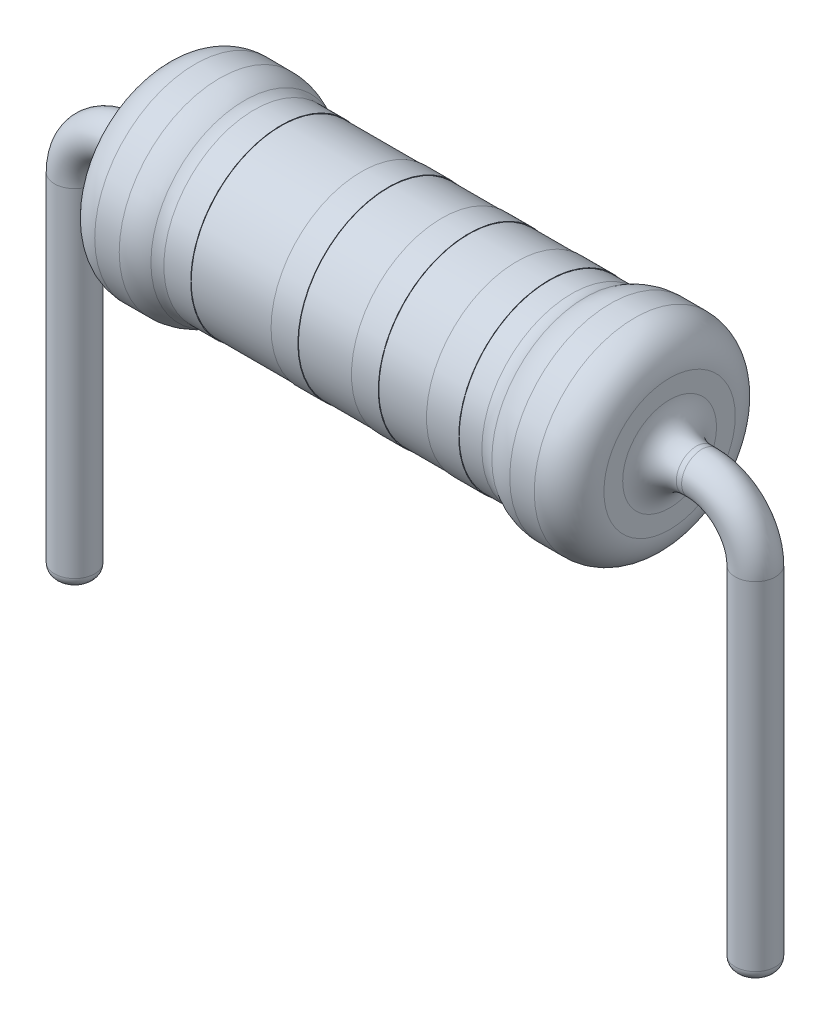
ISO-10303-21;
HEADER;
FILE_DESCRIPTION(('STEP AP214'),'2;1');
FILE_NAME('part.step','',(''),(''),'','','');
FILE_SCHEMA(('AUTOMOTIVE_DESIGN { 1 0 10303 214 1 1 1 1 }'));
ENDSEC;
DATA;
#1=APPLICATION_CONTEXT('core data for automotive mechanical design processes');
#2=APPLICATION_PROTOCOL_DEFINITION('international standard','automotive_design',2000,#1);
#3=PRODUCT_CONTEXT('',#1,'mechanical');
#4=PRODUCT('Part','Part','',(#3));
#5=PRODUCT_RELATED_PRODUCT_CATEGORY('part','',(#4));
#6=PRODUCT_DEFINITION_FORMATION('','',#4);
#7=PRODUCT_DEFINITION_CONTEXT('part definition',#1,'design');
#8=PRODUCT_DEFINITION('design','',#6,#7);
#9=PRODUCT_DEFINITION_SHAPE('','',#8);
#10=(LENGTH_UNIT() NAMED_UNIT(*) SI_UNIT(.MILLI.,.METRE.));
#11=(NAMED_UNIT(*) PLANE_ANGLE_UNIT() SI_UNIT($,.RADIAN.));
#12=(NAMED_UNIT(*) SI_UNIT($,.STERADIAN.) SOLID_ANGLE_UNIT());
#13=UNCERTAINTY_MEASURE_WITH_UNIT(LENGTH_MEASURE(1.E-05),#10,'distance_accuracy_value','');
#14=(GEOMETRIC_REPRESENTATION_CONTEXT(3) GLOBAL_UNCERTAINTY_ASSIGNED_CONTEXT((#13)) GLOBAL_UNIT_ASSIGNED_CONTEXT((#10,
#11,#12)) REPRESENTATION_CONTEXT('',''));
#15=CARTESIAN_POINT('',(0.,0.,0.));
#16=DIRECTION('',(0.,0.,1.));
#17=DIRECTION('',(1.,0.,0.));
#18=AXIS2_PLACEMENT_3D('',#15,#16,#17);
#19=CARTESIAN_POINT('',(6.35,0.,0.));
#20=DIRECTION('',(0.,-1.,0.));
#21=DIRECTION('',(0.,0.,-1.));
#22=AXIS2_PLACEMENT_3D('',#19,#20,#21);
#23=PLANE('',#22);
#24=CARTESIAN_POINT('',(6.35,0.,0.));
#25=DIRECTION('',(0.,1.,0.));
#26=DIRECTION('',(0.,0.,1.));
#27=AXIS2_PLACEMENT_3D('',#24,#25,#26);
#28=CIRCLE('',#27,0.175);
#29=CARTESIAN_POINT('',(6.35,0.,0.175000000000002));
#30=VERTEX_POINT('',#29);
#31=CARTESIAN_POINT('',(6.35,0.,-0.174999999999999));
#32=VERTEX_POINT('',#31);
#33=EDGE_CURVE('E73',#30,#32,#28,.T.);
#34=ORIENTED_EDGE('',*,*,#33,.F.);
#35=CARTESIAN_POINT('',(6.35,0.,0.));
#36=DIRECTION('',(0.,1.,0.));
#37=DIRECTION('',(0.,0.,-1.));
#38=AXIS2_PLACEMENT_3D('',#35,#36,#37);
#39=CIRCLE('',#38,0.175);
#40=EDGE_CURVE('E69',#32,#30,#39,.T.);
#41=ORIENTED_EDGE('',*,*,#40,.F.);
#42=EDGE_LOOP('',(#34,#41));
#43=FACE_BOUND('',#42,.T.);
#44=ADVANCED_FACE('F16',(#43),#23,.T.);
#45=CARTESIAN_POINT('',(6.35,0.2,-0.174999999999999));
#46=DIRECTION('',(1.,0.,0.));
#47=DIRECTION('',(0.,0.,-1.));
#48=AXIS2_PLACEMENT_3D('',#45,#46,#47);
#49=CIRCLE('',#48,0.2);
#50=TRIMMED_CURVE('',#49,(PARAMETER_VALUE(-2.63623214330564)),
(PARAMETER_VALUE(2.63623214330564)),.T.,.PARAMETER.);
#51=CARTESIAN_POINT('',(6.35,0.2,0.));
#52=DIRECTION('',(0.,-1.,0.));
#53=AXIS1_PLACEMENT('',#51,#52);
#54=SURFACE_OF_REVOLUTION('',#50,#53);
#55=ORIENTED_EDGE('',*,*,#40,.T.);
#56=ORIENTED_EDGE('',*,*,#33,.T.);
#57=EDGE_LOOP('',(#55,#56));
#58=FACE_BOUND('',#57,.T.);
#59=CARTESIAN_POINT('',(6.35,0.2,0.));
#60=DIRECTION('',(0.,1.,0.));
#61=DIRECTION('',(0.,0.,1.));
#62=AXIS2_PLACEMENT_3D('',#59,#60,#61);
#63=CIRCLE('',#62,0.375);
#64=CARTESIAN_POINT('',(6.35,0.2,0.375000000000002));
#65=VERTEX_POINT('',#64);
#66=EDGE_CURVE('E80',#65,#65,#63,.T.);
#67=ORIENTED_EDGE('',*,*,#66,.F.);
#68=EDGE_LOOP('',(#67));
#69=FACE_BOUND('',#68,.T.);
#70=ADVANCED_FACE('F78',(#58,#69),#54,.F.);
#71=CARTESIAN_POINT('',(6.35,0.,0.));
#72=DIRECTION('',(0.,1.,0.));
#73=DIRECTION('',(0.,0.,1.));
#74=AXIS2_PLACEMENT_3D('',#71,#72,#73);
#75=CYLINDRICAL_SURFACE('',#74,0.375);
#76=CARTESIAN_POINT('',(6.35,6.5,0.));
#77=DIRECTION('',(0.,1.,0.));
#78=DIRECTION('',(0.,0.,1.));
#79=AXIS2_PLACEMENT_3D('',#76,#77,#78);
#80=CIRCLE('',#79,0.375);
#81=CARTESIAN_POINT('',(6.725,6.5,0.));
#82=VERTEX_POINT('',#81);
#83=EDGE_CURVE('E107',#82,#82,#80,.T.);
#84=ORIENTED_EDGE('',*,*,#83,.F.);
#85=EDGE_LOOP('',(#84));
#86=FACE_BOUND('',#85,.T.);
#87=ORIENTED_EDGE('',*,*,#66,.T.);
#88=EDGE_LOOP('',(#87));
#89=FACE_BOUND('',#88,.T.);
#90=ADVANCED_FACE('F97',(#86,#89),#75,.T.);
#91=CARTESIAN_POINT('',(5.35,6.5,0.));
#92=DIRECTION('',(0.,0.,1.));
#93=DIRECTION('',(1.,0.,0.));
#94=AXIS2_PLACEMENT_3D('',#91,#92,#93);
#95=TOROIDAL_SURFACE('',#94,1.,0.375);
#96=CARTESIAN_POINT('',(5.35,7.5,0.));
#97=DIRECTION('',(-1.,0.,0.));
#98=DIRECTION('',(0.,0.,1.));
#99=AXIS2_PLACEMENT_3D('',#96,#97,#98);
#100=CIRCLE('',#99,0.375);
#101=CARTESIAN_POINT('',(5.35,7.87500000000001,0.));
#102=VERTEX_POINT('',#101);
#103=EDGE_CURVE('E105',#102,#102,#100,.T.);
#104=CARTESIAN_POINT('',(5.35,6.5,0.));
#105=DIRECTION('',(0.,0.,1.));
#106=DIRECTION('',(1.,0.,0.));
#107=AXIS2_PLACEMENT_3D('',#104,#105,#106);
#108=CIRCLE('',#107,1.375);
#109=EDGE_CURVE('',#82,#102,#108,.T.);
#110=ORIENTED_EDGE('',*,*,#83,.T.);
#111=ORIENTED_EDGE('',*,*,#103,.F.);
#112=ORIENTED_EDGE('',*,*,#109,.T.);
#113=ORIENTED_EDGE('',*,*,#109,.F.);
#114=EDGE_LOOP('',(#110,#112,#111,#113));
#115=FACE_BOUND('',#114,.T.);
#116=ADVANCED_FACE('F124',(#115),#95,.T.);
#117=CARTESIAN_POINT('',(5.35,7.5,0.));
#118=DIRECTION('',(-1.,0.,0.));
#119=DIRECTION('',(0.,0.,1.));
#120=AXIS2_PLACEMENT_3D('',#117,#118,#119);
#121=CYLINDRICAL_SURFACE('',#120,0.375);
#122=CARTESIAN_POINT('',(5.25,7.5,0.));
#123=DIRECTION('',(1.,0.,0.));
#124=DIRECTION('',(0.,0.,-1.));
#125=AXIS2_PLACEMENT_3D('',#122,#123,#124);
#126=CIRCLE('',#125,0.375);
#127=CARTESIAN_POINT('',(5.25,7.5,-0.375));
#128=VERTEX_POINT('',#127);
#129=EDGE_CURVE('E119',#128,#128,#126,.T.);
#130=ORIENTED_EDGE('',*,*,#129,.T.);
#131=EDGE_LOOP('',(#130));
#132=FACE_BOUND('',#131,.T.);
#133=ORIENTED_EDGE('',*,*,#103,.T.);
#134=EDGE_LOOP('',(#133));
#135=FACE_BOUND('',#134,.T.);
#136=ADVANCED_FACE('F130',(#132,#135),#121,.T.);
#137=CARTESIAN_POINT('',(5.25,7.5,0.));
#138=DIRECTION('',(1.,0.,0.));
#139=DIRECTION('',(0.,0.,-1.));
#140=AXIS2_PLACEMENT_3D('',#137,#138,#139);
#141=TOROIDAL_SURFACE('',#140,0.875,0.5);
#142=ORIENTED_EDGE('',*,*,#129,.F.);
#143=EDGE_LOOP('',(#142));
#144=FACE_BOUND('',#143,.T.);
#145=CARTESIAN_POINT('',(4.75,7.5,0.));
#146=DIRECTION('',(1.,0.,0.));
#147=DIRECTION('',(0.,0.,1.));
#148=AXIS2_PLACEMENT_3D('',#145,#146,#147);
#149=CIRCLE('',#148,0.875);
#150=CARTESIAN_POINT('',(4.75,7.5,-0.875));
#151=VERTEX_POINT('',#150);
#152=CARTESIAN_POINT('',(4.75,7.5,0.875));
#153=VERTEX_POINT('',#152);
#154=EDGE_CURVE('E344',#151,#153,#149,.F.);
#155=ORIENTED_EDGE('',*,*,#154,.F.);
#156=CARTESIAN_POINT('',(4.75,7.5,0.));
#157=DIRECTION('',(1.,0.,0.));
#158=DIRECTION('',(0.,0.,-1.));
#159=AXIS2_PLACEMENT_3D('',#156,#157,#158);
#160=CIRCLE('',#159,0.875);
#161=EDGE_CURVE('E354',#153,#151,#160,.F.);
#162=ORIENTED_EDGE('',*,*,#161,.F.);
#163=EDGE_LOOP('',(#155,#162));
#164=FACE_BOUND('',#163,.T.);
#165=ADVANCED_FACE('F374',(#144,#164),#141,.F.);
#166=CARTESIAN_POINT('',(4.75,0.,0.));
#167=DIRECTION('',(1.,0.,0.));
#168=DIRECTION('',(0.,0.,-1.));
#169=AXIS2_PLACEMENT_3D('',#166,#167,#168);
#170=PLANE('',#169);
#171=ORIENTED_EDGE('',*,*,#154,.T.);
#172=ORIENTED_EDGE('',*,*,#161,.T.);
#173=EDGE_LOOP('',(#171,#172));
#174=FACE_BOUND('',#173,.T.);
#175=CARTESIAN_POINT('',(4.75,7.5,0.));
#176=DIRECTION('',(-1.,0.,0.));
#177=DIRECTION('',(0.,0.,1.));
#178=AXIS2_PLACEMENT_3D('',#175,#176,#177);
#179=CIRCLE('',#178,1.225);
#180=CARTESIAN_POINT('',(4.75,7.5,1.225));
#181=VERTEX_POINT('',#180);
#182=CARTESIAN_POINT('',(4.75,7.5,-1.225));
#183=VERTEX_POINT('',#182);
#184=EDGE_CURVE('E290',#181,#183,#179,.T.);
#185=ORIENTED_EDGE('',*,*,#184,.F.);
#186=CARTESIAN_POINT('',(4.75,7.5,0.));
#187=DIRECTION('',(-1.,0.,0.));
#188=DIRECTION('',(0.,0.,-1.));
#189=AXIS2_PLACEMENT_3D('',#186,#187,#188);
#190=CIRCLE('',#189,1.225);
#191=EDGE_CURVE('E331',#183,#181,#190,.T.);
#192=ORIENTED_EDGE('',*,*,#191,.F.);
#193=EDGE_LOOP('',(#185,#192));
#194=FACE_BOUND('',#193,.T.);
#195=ADVANCED_FACE('F309',(#174,#194),#170,.T.);
#196=CARTESIAN_POINT('',(4.1,7.5,0.));
#197=DIRECTION('',(1.,0.,0.));
#198=DIRECTION('',(0.,0.,-1.));
#199=AXIS2_PLACEMENT_3D('',#196,#197,#198);
#200=TOROIDAL_SURFACE('',#199,1.225,0.65);
#201=CARTESIAN_POINT('',(4.1,7.5,0.));
#202=DIRECTION('',(-1.,0.,0.));
#203=DIRECTION('',(0.,0.,1.));
#204=AXIS2_PLACEMENT_3D('',#201,#202,#203);
#205=CIRCLE('',#204,1.875);
#206=CARTESIAN_POINT('',(4.1,7.5,1.875));
#207=VERTEX_POINT('',#206);
#208=EDGE_CURVE('E318',#207,#207,#205,.T.);
#209=ORIENTED_EDGE('',*,*,#208,.F.);
#210=EDGE_LOOP('',(#209));
#211=FACE_BOUND('',#210,.T.);
#212=ORIENTED_EDGE('',*,*,#191,.T.);
#213=ORIENTED_EDGE('',*,*,#184,.T.);
#214=EDGE_LOOP('',(#212,#213));
#215=FACE_BOUND('',#214,.T.);
#216=ADVANCED_FACE('F297',(#211,#215),#200,.T.);
#217=CARTESIAN_POINT('',(-4.75,7.5,0.));
#218=DIRECTION('',(-1.,0.,0.));
#219=DIRECTION('',(0.,0.,1.));
#220=AXIS2_PLACEMENT_3D('',#217,#218,#219);
#221=CYLINDRICAL_SURFACE('',#220,1.875);
#222=ORIENTED_EDGE('',*,*,#208,.T.);
#223=EDGE_LOOP('',(#222));
#224=FACE_BOUND('',#223,.T.);
#225=CARTESIAN_POINT('',(3.64302352755487,7.5,0.));
#226=DIRECTION('',(-1.,0.,0.));
#227=DIRECTION('',(0.,0.,1.));
#228=AXIS2_PLACEMENT_3D('',#225,#226,#227);
#229=CIRCLE('',#228,1.875);
#230=CARTESIAN_POINT('',(3.64302352755487,7.5,1.875));
#231=VERTEX_POINT('',#230);
#232=EDGE_CURVE('E397',#231,#231,#229,.T.);
#233=ORIENTED_EDGE('',*,*,#232,.F.);
#234=EDGE_LOOP('',(#233));
#235=FACE_BOUND('',#234,.T.);
#236=ADVANCED_FACE('F308',(#224,#235),#221,.T.);
#237=CARTESIAN_POINT('',(3.64302352755487,7.5,0.));
#238=DIRECTION('',(-1.,0.,0.));
#239=DIRECTION('',(0.,0.,1.));
#240=AXIS2_PLACEMENT_3D('',#237,#238,#239);
#241=TOROIDAL_SURFACE('',#240,0.977263692076684,0.897736307923315);
#242=ORIENTED_EDGE('',*,*,#232,.T.);
#243=EDGE_LOOP('',(#242));
#244=FACE_BOUND('',#243,.T.);
#245=CARTESIAN_POINT('',(3.18027316591826,7.5,0.));
#246=DIRECTION('',(-1.,0.,0.));
#247=DIRECTION('',(0.,0.,1.));
#248=AXIS2_PLACEMENT_3D('',#245,#246,#247);
#249=CIRCLE('',#248,1.74654425297041);
#250=CARTESIAN_POINT('',(3.18027316591826,7.5,1.74654425297041));
#251=VERTEX_POINT('',#250);
#252=EDGE_CURVE('E404',#251,#251,#249,.F.);
#253=ORIENTED_EDGE('',*,*,#252,.T.);
#254=EDGE_LOOP('',(#253));
#255=FACE_BOUND('',#254,.T.);
#256=ADVANCED_FACE('F435',(#244,#255),#241,.T.);
#257=CARTESIAN_POINT('',(-6.35,0.,0.));
#258=DIRECTION('',(0.,-1.,0.));
#259=DIRECTION('',(0.,0.,-1.));
#260=AXIS2_PLACEMENT_3D('',#257,#258,#259);
#261=PLANE('',#260);
#262=CARTESIAN_POINT('',(-6.35,0.,0.));
#263=DIRECTION('',(0.,1.,0.));
#264=DIRECTION('',(0.,0.,1.));
#265=AXIS2_PLACEMENT_3D('',#262,#263,#264);
#266=CIRCLE('',#265,0.175);
#267=CARTESIAN_POINT('',(-6.35,0.,0.175));
#268=VERTEX_POINT('',#267);
#269=CARTESIAN_POINT('',(-6.35,0.,-0.175));
#270=VERTEX_POINT('',#269);
#271=EDGE_CURVE('E401',#268,#270,#266,.T.);
#272=ORIENTED_EDGE('',*,*,#271,.F.);
#273=CARTESIAN_POINT('',(-6.35,0.,0.));
#274=DIRECTION('',(0.,1.,0.));
#275=DIRECTION('',(0.,0.,-1.));
#276=AXIS2_PLACEMENT_3D('',#273,#274,#275);
#277=CIRCLE('',#276,0.175);
#278=EDGE_CURVE('E407',#270,#268,#277,.T.);
#279=ORIENTED_EDGE('',*,*,#278,.F.);
#280=EDGE_LOOP('',(#272,#279));
#281=FACE_BOUND('',#280,.T.);
#282=ADVANCED_FACE('F427',(#281),#261,.T.);
#283=CARTESIAN_POINT('',(2.92254138123248,7.5,0.));
#284=DIRECTION('',(-1.,0.,0.));
#285=DIRECTION('',(0.,0.,1.));
#286=AXIS2_PLACEMENT_3D('',#283,#284,#285);
#287=TOROIDAL_SURFACE('',#286,2.175,0.5);
#288=ORIENTED_EDGE('',*,*,#252,.F.);
#289=EDGE_LOOP('',(#288));
#290=FACE_BOUND('',#289,.T.);
#291=CARTESIAN_POINT('',(2.92254138123248,7.5,0.));
#292=DIRECTION('',(-1.,0.,0.));
#293=DIRECTION('',(0.,0.,1.));
#294=AXIS2_PLACEMENT_3D('',#291,#292,#293);
#295=CIRCLE('',#294,1.675);
#296=CARTESIAN_POINT('',(2.92254138123248,7.5,1.675));
#297=VERTEX_POINT('',#296);
#298=EDGE_CURVE('E260',#297,#297,#295,.T.);
#299=ORIENTED_EDGE('',*,*,#298,.F.);
#300=EDGE_LOOP('',(#299));
#301=FACE_BOUND('',#300,.T.);
#302=ADVANCED_FACE('F269',(#290,#301),#287,.F.);
#303=CARTESIAN_POINT('',(-6.35,0.200000000000001,-0.175));
#304=DIRECTION('',(1.,0.,0.));
#305=DIRECTION('',(0.,0.,-1.));
#306=AXIS2_PLACEMENT_3D('',#303,#304,#305);
#307=CIRCLE('',#306,0.2);
#308=TRIMMED_CURVE('',#307,(PARAMETER_VALUE(-2.63623214330564)),
(PARAMETER_VALUE(2.63623214330564)),.T.,.PARAMETER.);
#309=CARTESIAN_POINT('',(-6.35,0.200000000000001,0.));
#310=DIRECTION('',(0.,-1.,0.));
#311=AXIS1_PLACEMENT('',#309,#310);
#312=SURFACE_OF_REVOLUTION('',#308,#311);
#313=CARTESIAN_POINT('',(-6.35,0.200000000000001,0.));
#314=DIRECTION('',(0.,1.,0.));
#315=DIRECTION('',(0.,0.,1.));
#316=AXIS2_PLACEMENT_3D('',#313,#314,#315);
#317=CIRCLE('',#316,0.375);
#318=CARTESIAN_POINT('',(-6.35,0.200000000000001,0.375));
#319=VERTEX_POINT('',#318);
#320=EDGE_CURVE('E408',#319,#319,#317,.T.);
#321=ORIENTED_EDGE('',*,*,#320,.F.);
#322=EDGE_LOOP('',(#321));
#323=FACE_BOUND('',#322,.T.);
#324=ORIENTED_EDGE('',*,*,#278,.T.);
#325=ORIENTED_EDGE('',*,*,#271,.T.);
#326=EDGE_LOOP('',(#324,#325));
#327=FACE_BOUND('',#326,.T.);
#328=ADVANCED_FACE('F263',(#323,#327),#312,.F.);
#329=CARTESIAN_POINT('',(-4.75,7.5,0.));
#330=DIRECTION('',(-1.,0.,0.));
#331=DIRECTION('',(0.,0.,1.));
#332=AXIS2_PLACEMENT_3D('',#329,#330,#331);
#333=CYLINDRICAL_SURFACE('',#332,1.675);
#334=ORIENTED_EDGE('',*,*,#298,.T.);
#335=EDGE_LOOP('',(#334));
#336=FACE_BOUND('',#335,.T.);
#337=CARTESIAN_POINT('',(2.5,7.5,0.));
#338=DIRECTION('',(-1.,0.,0.));
#339=DIRECTION('',(0.,0.,1.));
#340=AXIS2_PLACEMENT_3D('',#337,#338,#339);
#341=CIRCLE('',#340,1.675);
#342=CARTESIAN_POINT('',(2.5,7.5,1.675));
#343=VERTEX_POINT('',#342);
#344=EDGE_CURVE('E410',#343,#343,#341,.T.);
#345=ORIENTED_EDGE('',*,*,#344,.F.);
#346=EDGE_LOOP('',(#345));
#347=FACE_BOUND('',#346,.T.);
#348=ADVANCED_FACE('F268',(#336,#347),#333,.T.);
#349=CARTESIAN_POINT('',(-6.35,0.,0.));
#350=DIRECTION('',(0.,1.,0.));
#351=DIRECTION('',(0.,0.,1.));
#352=AXIS2_PLACEMENT_3D('',#349,#350,#351);
#353=CYLINDRICAL_SURFACE('',#352,0.375);
#354=ORIENTED_EDGE('',*,*,#320,.T.);
#355=EDGE_LOOP('',(#354));
#356=FACE_BOUND('',#355,.T.);
#357=CARTESIAN_POINT('',(-6.35,6.5,0.));
#358=DIRECTION('',(0.,1.,0.));
#359=DIRECTION('',(0.,0.,1.));
#360=AXIS2_PLACEMENT_3D('',#357,#358,#359);
#361=CIRCLE('',#360,0.375);
#362=CARTESIAN_POINT('',(-6.725,6.5,0.));
#363=VERTEX_POINT('',#362);
#364=EDGE_CURVE('E414',#363,#363,#361,.T.);
#365=ORIENTED_EDGE('',*,*,#364,.F.);
#366=EDGE_LOOP('',(#365));
#367=FACE_BOUND('',#366,.T.);
#368=ADVANCED_FACE('F589',(#356,#367),#353,.T.);
#369=CARTESIAN_POINT('',(2.5,7.5,0.));
#370=DIRECTION('',(1.,0.,0.));
#371=DIRECTION('',(0.,0.,-1.));
#372=AXIS2_PLACEMENT_3D('',#369,#370,#371);
#373=PLANE('',#372);
#374=CARTESIAN_POINT('',(2.5,7.5,0.));
#375=DIRECTION('',(1.,0.,0.));
#376=DIRECTION('',(0.,0.,-1.));
#377=AXIS2_PLACEMENT_3D('',#374,#375,#376);
#378=CIRCLE('',#377,1.685);
#379=CARTESIAN_POINT('',(2.5,7.5,-1.685));
#380=VERTEX_POINT('',#379);
#381=EDGE_CURVE('E257',#380,#380,#378,.F.);
#382=ORIENTED_EDGE('',*,*,#381,.F.);
#383=EDGE_LOOP('',(#382));
#384=FACE_BOUND('',#383,.T.);
#385=ORIENTED_EDGE('',*,*,#344,.T.);
#386=EDGE_LOOP('',(#385));
#387=FACE_BOUND('',#386,.T.);
#388=ADVANCED_FACE('F586',(#384,#387),#373,.T.);
#389=CARTESIAN_POINT('',(-5.35,6.5,0.));
#390=DIRECTION('',(0.,0.,-1.));
#391=DIRECTION('',(-1.,0.,0.));
#392=AXIS2_PLACEMENT_3D('',#389,#390,#391);
#393=TOROIDAL_SURFACE('',#392,1.,0.375);
#394=CARTESIAN_POINT('',(-5.35,7.5,0.));
#395=DIRECTION('',(1.,0.,0.));
#396=DIRECTION('',(0.,0.,-1.));
#397=AXIS2_PLACEMENT_3D('',#394,#395,#396);
#398=CIRCLE('',#397,0.375);
#399=CARTESIAN_POINT('',(-5.35,7.87500000000001,0.));
#400=VERTEX_POINT('',#399);
#401=EDGE_CURVE('E254',#400,#400,#398,.T.);
#402=CARTESIAN_POINT('',(-5.35,6.5,0.));
#403=DIRECTION('',(0.,0.,-1.));
#404=DIRECTION('',(-1.,0.,0.));
#405=AXIS2_PLACEMENT_3D('',#402,#403,#404);
#406=CIRCLE('',#405,1.375);
#407=EDGE_CURVE('',#363,#400,#406,.T.);
#408=ORIENTED_EDGE('',*,*,#364,.T.);
#409=ORIENTED_EDGE('',*,*,#401,.F.);
#410=ORIENTED_EDGE('',*,*,#407,.T.);
#411=ORIENTED_EDGE('',*,*,#407,.F.);
#412=EDGE_LOOP('',(#408,#410,#409,#411));
#413=FACE_BOUND('',#412,.T.);
#414=ADVANCED_FACE('F581',(#413),#393,.T.);
#415=CARTESIAN_POINT('',(1.9,7.5,0.));
#416=DIRECTION('',(1.,0.,0.));
#417=DIRECTION('',(0.,0.,-1.));
#418=AXIS2_PLACEMENT_3D('',#415,#416,#417);
#419=CYLINDRICAL_SURFACE('',#418,1.685);
#420=ORIENTED_EDGE('',*,*,#381,.T.);
#421=EDGE_LOOP('',(#420));
#422=FACE_BOUND('',#421,.T.);
#423=CARTESIAN_POINT('',(1.9,7.5,0.));
#424=DIRECTION('',(1.,0.,0.));
#425=DIRECTION('',(0.,0.,-1.));
#426=AXIS2_PLACEMENT_3D('',#423,#424,#425);
#427=CIRCLE('',#426,1.685);
#428=CARTESIAN_POINT('',(1.9,7.5,-1.685));
#429=VERTEX_POINT('',#428);
#430=EDGE_CURVE('E253',#429,#429,#427,.T.);
#431=ORIENTED_EDGE('',*,*,#430,.T.);
#432=EDGE_LOOP('',(#431));
#433=FACE_BOUND('',#432,.T.);
#434=ADVANCED_FACE('F576',(#422,#433),#419,.T.);
#435=CARTESIAN_POINT('',(-5.35,7.5,0.));
#436=DIRECTION('',(1.,0.,0.));
#437=DIRECTION('',(0.,0.,-1.));
#438=AXIS2_PLACEMENT_3D('',#435,#436,#437);
#439=CYLINDRICAL_SURFACE('',#438,0.375);
#440=CARTESIAN_POINT('',(-5.25,7.5,0.));
#441=DIRECTION('',(-1.,0.,0.));
#442=DIRECTION('',(0.,0.,1.));
#443=AXIS2_PLACEMENT_3D('',#440,#441,#442);
#444=CIRCLE('',#443,0.375);
#445=CARTESIAN_POINT('',(-5.25,7.5,0.375));
#446=VERTEX_POINT('',#445);
#447=EDGE_CURVE('E244',#446,#446,#444,.T.);
#448=ORIENTED_EDGE('',*,*,#447,.T.);
#449=EDGE_LOOP('',(#448));
#450=FACE_BOUND('',#449,.T.);
#451=ORIENTED_EDGE('',*,*,#401,.T.);
#452=EDGE_LOOP('',(#451));
#453=FACE_BOUND('',#452,.T.);
#454=ADVANCED_FACE('F571',(#450,#453),#439,.T.);
#455=CARTESIAN_POINT('',(1.9,7.5,0.));
#456=DIRECTION('',(1.,0.,0.));
#457=DIRECTION('',(0.,0.,-1.));
#458=AXIS2_PLACEMENT_3D('',#455,#456,#457);
#459=PLANE('',#458);
#460=ORIENTED_EDGE('',*,*,#430,.F.);
#461=EDGE_LOOP('',(#460));
#462=FACE_BOUND('',#461,.T.);
#463=CARTESIAN_POINT('',(1.9,7.5,0.));
#464=DIRECTION('',(-1.,0.,0.));
#465=DIRECTION('',(0.,0.,1.));
#466=AXIS2_PLACEMENT_3D('',#463,#464,#465);
#467=CIRCLE('',#466,1.675);
#468=CARTESIAN_POINT('',(1.9,7.5,1.675));
#469=VERTEX_POINT('',#468);
#470=EDGE_CURVE('E252',#469,#469,#467,.T.);
#471=ORIENTED_EDGE('',*,*,#470,.F.);
#472=EDGE_LOOP('',(#471));
#473=FACE_BOUND('',#472,.T.);
#474=ADVANCED_FACE('F233',(#462,#473),#459,.F.);
#475=CARTESIAN_POINT('',(-5.25,7.5,0.));
#476=DIRECTION('',(-1.,0.,0.));
#477=DIRECTION('',(0.,0.,1.));
#478=AXIS2_PLACEMENT_3D('',#475,#476,#477);
#479=TOROIDAL_SURFACE('',#478,0.875,0.5);
#480=ORIENTED_EDGE('',*,*,#447,.F.);
#481=EDGE_LOOP('',(#480));
#482=FACE_BOUND('',#481,.T.);
#483=CARTESIAN_POINT('',(-4.75,7.5,0.));
#484=DIRECTION('',(-1.,0.,0.));
#485=DIRECTION('',(0.,0.,-1.));
#486=AXIS2_PLACEMENT_3D('',#483,#484,#485);
#487=CIRCLE('',#486,0.875);
#488=CARTESIAN_POINT('',(-4.75,7.5,0.875));
#489=VERTEX_POINT('',#488);
#490=CARTESIAN_POINT('',(-4.75,7.5,-0.875));
#491=VERTEX_POINT('',#490);
#492=EDGE_CURVE('E215',#489,#491,#487,.F.);
#493=ORIENTED_EDGE('',*,*,#492,.F.);
#494=CARTESIAN_POINT('',(-4.75,7.5,0.));
#495=DIRECTION('',(-1.,0.,0.));
#496=DIRECTION('',(0.,0.,1.));
#497=AXIS2_PLACEMENT_3D('',#494,#495,#496);
#498=CIRCLE('',#497,0.875);
#499=EDGE_CURVE('E240',#491,#489,#498,.F.);
#500=ORIENTED_EDGE('',*,*,#499,.F.);
#501=EDGE_LOOP('',(#493,#500));
#502=FACE_BOUND('',#501,.T.);
#503=ADVANCED_FACE('F222',(#482,#502),#479,.F.);
#504=CARTESIAN_POINT('',(-4.75,7.5,0.));
#505=DIRECTION('',(-1.,0.,0.));
#506=DIRECTION('',(0.,0.,1.));
#507=AXIS2_PLACEMENT_3D('',#504,#505,#506);
#508=CYLINDRICAL_SURFACE('',#507,1.675);
#509=ORIENTED_EDGE('',*,*,#470,.T.);
#510=EDGE_LOOP('',(#509));
#511=FACE_BOUND('',#510,.T.);
#512=CARTESIAN_POINT('',(1.,7.5,0.));
#513=DIRECTION('',(-1.,0.,0.));
#514=DIRECTION('',(0.,0.,1.));
#515=AXIS2_PLACEMENT_3D('',#512,#513,#514);
#516=CIRCLE('',#515,1.675);
#517=CARTESIAN_POINT('',(1.,7.5,1.675));
#518=VERTEX_POINT('',#517);
#519=EDGE_CURVE('E459',#518,#518,#516,.T.);
#520=ORIENTED_EDGE('',*,*,#519,.F.);
#521=EDGE_LOOP('',(#520));
#522=FACE_BOUND('',#521,.T.);
#523=ADVANCED_FACE('F232',(#511,#522),#508,.T.);
#524=CARTESIAN_POINT('',(-4.75,0.,0.));
#525=DIRECTION('',(-1.,0.,0.));
#526=DIRECTION('',(0.,0.,1.));
#527=AXIS2_PLACEMENT_3D('',#524,#525,#526);
#528=PLANE('',#527);
#529=ORIENTED_EDGE('',*,*,#492,.T.);
#530=ORIENTED_EDGE('',*,*,#499,.T.);
#531=EDGE_LOOP('',(#529,#530));
#532=FACE_BOUND('',#531,.T.);
#533=CARTESIAN_POINT('',(-4.75,7.5,0.));
#534=DIRECTION('',(1.,0.,0.));
#535=DIRECTION('',(0.,0.,-1.));
#536=AXIS2_PLACEMENT_3D('',#533,#534,#535);
#537=CIRCLE('',#536,1.225);
#538=CARTESIAN_POINT('',(-4.75,7.5,-1.225));
#539=VERTEX_POINT('',#538);
#540=CARTESIAN_POINT('',(-4.75,7.5,1.225));
#541=VERTEX_POINT('',#540);
#542=EDGE_CURVE('E36',#539,#541,#537,.T.);
#543=ORIENTED_EDGE('',*,*,#542,.F.);
#544=CARTESIAN_POINT('',(-4.75,7.5,0.));
#545=DIRECTION('',(1.,0.,0.));
#546=DIRECTION('',(0.,0.,1.));
#547=AXIS2_PLACEMENT_3D('',#544,#545,#546);
#548=CIRCLE('',#547,1.225);
#549=EDGE_CURVE('E465',#541,#539,#548,.T.);
#550=ORIENTED_EDGE('',*,*,#549,.F.);
#551=EDGE_LOOP('',(#543,#550));
#552=FACE_BOUND('',#551,.T.);
#553=ADVANCED_FACE('F521',(#532,#552),#528,.T.);
#554=CARTESIAN_POINT('',(1.,7.5,0.));
#555=DIRECTION('',(1.,0.,0.));
#556=DIRECTION('',(0.,0.,-1.));
#557=AXIS2_PLACEMENT_3D('',#554,#555,#556);
#558=PLANE('',#557);
#559=CARTESIAN_POINT('',(1.,7.5,0.));
#560=DIRECTION('',(1.,0.,0.));
#561=DIRECTION('',(0.,0.,-1.));
#562=AXIS2_PLACEMENT_3D('',#559,#560,#561);
#563=CIRCLE('',#562,1.685);
#564=CARTESIAN_POINT('',(1.,7.5,-1.685));
#565=VERTEX_POINT('',#564);
#566=EDGE_CURVE('E462',#565,#565,#563,.F.);
#567=ORIENTED_EDGE('',*,*,#566,.F.);
#568=EDGE_LOOP('',(#567));
#569=FACE_BOUND('',#568,.T.);
#570=ORIENTED_EDGE('',*,*,#519,.T.);
#571=EDGE_LOOP('',(#570));
#572=FACE_BOUND('',#571,.T.);
#573=ADVANCED_FACE('F192',(#569,#572),#558,.T.);
#574=CARTESIAN_POINT('',(-4.1,7.5,0.));
#575=DIRECTION('',(-1.,0.,0.));
#576=DIRECTION('',(0.,0.,1.));
#577=AXIS2_PLACEMENT_3D('',#574,#575,#576);
#578=TOROIDAL_SURFACE('',#577,1.225,0.65);
#579=CARTESIAN_POINT('',(-4.1,7.5,0.));
#580=DIRECTION('',(-1.,0.,0.));
#581=DIRECTION('',(0.,0.,1.));
#582=AXIS2_PLACEMENT_3D('',#579,#580,#581);
#583=CIRCLE('',#582,1.875);
#584=CARTESIAN_POINT('',(-4.1,7.5,1.875));
#585=VERTEX_POINT('',#584);
#586=EDGE_CURVE('E183',#585,#585,#583,.F.);
#587=ORIENTED_EDGE('',*,*,#586,.F.);
#588=EDGE_LOOP('',(#587));
#589=FACE_BOUND('',#588,.T.);
#590=ORIENTED_EDGE('',*,*,#549,.T.);
#591=ORIENTED_EDGE('',*,*,#542,.T.);
#592=EDGE_LOOP('',(#590,#591));
#593=FACE_BOUND('',#592,.T.);
#594=ADVANCED_FACE('F186',(#589,#593),#578,.T.);
#595=CARTESIAN_POINT('',(0.5,7.5,0.));
#596=DIRECTION('',(1.,0.,0.));
#597=DIRECTION('',(0.,0.,-1.));
#598=AXIS2_PLACEMENT_3D('',#595,#596,#597);
#599=CYLINDRICAL_SURFACE('',#598,1.685);
#600=ORIENTED_EDGE('',*,*,#566,.T.);
#601=EDGE_LOOP('',(#600));
#602=FACE_BOUND('',#601,.T.);
#603=CARTESIAN_POINT('',(0.5,7.5,0.));
#604=DIRECTION('',(1.,0.,0.));
#605=DIRECTION('',(0.,0.,-1.));
#606=AXIS2_PLACEMENT_3D('',#603,#604,#605);
#607=CIRCLE('',#606,1.685);
#608=CARTESIAN_POINT('',(0.5,7.5,-1.685));
#609=VERTEX_POINT('',#608);
#610=EDGE_CURVE('E180',#609,#609,#607,.T.);
#611=ORIENTED_EDGE('',*,*,#610,.T.);
#612=EDGE_LOOP('',(#611));
#613=FACE_BOUND('',#612,.T.);
#614=ADVANCED_FACE('F191',(#602,#613),#599,.T.);
#615=CARTESIAN_POINT('',(-4.75,7.5,0.));
#616=DIRECTION('',(-1.,0.,0.));
#617=DIRECTION('',(0.,0.,1.));
#618=AXIS2_PLACEMENT_3D('',#615,#616,#617);
#619=CYLINDRICAL_SURFACE('',#618,1.875);
#620=CARTESIAN_POINT('',(-3.64302352755487,7.5,0.));
#621=DIRECTION('',(1.,0.,0.));
#622=DIRECTION('',(0.,0.,-1.));
#623=AXIS2_PLACEMENT_3D('',#620,#621,#622);
#624=CIRCLE('',#623,1.875);
#625=CARTESIAN_POINT('',(-3.64302352755487,7.5,-1.875));
#626=VERTEX_POINT('',#625);
#627=EDGE_CURVE('E177',#626,#626,#624,.T.);
#628=ORIENTED_EDGE('',*,*,#627,.F.);
#629=EDGE_LOOP('',(#628));
#630=FACE_BOUND('',#629,.T.);
#631=ORIENTED_EDGE('',*,*,#586,.T.);
#632=EDGE_LOOP('',(#631));
#633=FACE_BOUND('',#632,.T.);
#634=ADVANCED_FACE('F509',(#630,#633),#619,.T.);
#635=CARTESIAN_POINT('',(0.5,7.5,0.));
#636=DIRECTION('',(1.,0.,0.));
#637=DIRECTION('',(0.,0.,-1.));
#638=AXIS2_PLACEMENT_3D('',#635,#636,#637);
#639=PLANE('',#638);
#640=ORIENTED_EDGE('',*,*,#610,.F.);
#641=EDGE_LOOP('',(#640));
#642=FACE_BOUND('',#641,.T.);
#643=CARTESIAN_POINT('',(0.5,7.5,0.));
#644=DIRECTION('',(-1.,0.,0.));
#645=DIRECTION('',(0.,0.,1.));
#646=AXIS2_PLACEMENT_3D('',#643,#644,#645);
#647=CIRCLE('',#646,1.675);
#648=CARTESIAN_POINT('',(0.5,7.5,1.675));
#649=VERTEX_POINT('',#648);
#650=EDGE_CURVE('E176',#649,#649,#647,.T.);
#651=ORIENTED_EDGE('',*,*,#650,.F.);
#652=EDGE_LOOP('',(#651));
#653=FACE_BOUND('',#652,.T.);
#654=ADVANCED_FACE('F506',(#642,#653),#639,.F.);
#655=CARTESIAN_POINT('',(-3.64302352755487,7.5,0.));
#656=DIRECTION('',(-1.,0.,0.));
#657=DIRECTION('',(0.,0.,1.));
#658=AXIS2_PLACEMENT_3D('',#655,#656,#657);
#659=TOROIDAL_SURFACE('',#658,0.977263692076682,0.897736307923316);
#660=CARTESIAN_POINT('',(-3.18027316591826,7.5,0.));
#661=DIRECTION('',(-1.,0.,0.));
#662=DIRECTION('',(0.,0.,1.));
#663=AXIS2_PLACEMENT_3D('',#660,#661,#662);
#664=CIRCLE('',#663,1.74654425297041);
#665=CARTESIAN_POINT('',(-3.18027316591826,7.5,1.74654425297041));
#666=VERTEX_POINT('',#665);
#667=EDGE_CURVE('E172',#666,#666,#664,.T.);
#668=ORIENTED_EDGE('',*,*,#667,.T.);
#669=EDGE_LOOP('',(#668));
#670=FACE_BOUND('',#669,.T.);
#671=ORIENTED_EDGE('',*,*,#627,.T.);
#672=EDGE_LOOP('',(#671));
#673=FACE_BOUND('',#672,.T.);
#674=ADVANCED_FACE('F18',(#670,#673),#659,.T.);
#675=CARTESIAN_POINT('',(-4.75,7.5,0.));
#676=DIRECTION('',(-1.,0.,0.));
#677=DIRECTION('',(0.,0.,1.));
#678=AXIS2_PLACEMENT_3D('',#675,#676,#677);
#679=CYLINDRICAL_SURFACE('',#678,1.675);
#680=ORIENTED_EDGE('',*,*,#650,.T.);
#681=EDGE_LOOP('',(#680));
#682=FACE_BOUND('',#681,.T.);
#683=CARTESIAN_POINT('',(-0.5,7.5,0.));
#684=DIRECTION('',(-1.,0.,0.));
#685=DIRECTION('',(0.,0.,1.));
#686=AXIS2_PLACEMENT_3D('',#683,#684,#685);
#687=CIRCLE('',#686,1.675);
#688=CARTESIAN_POINT('',(-0.5,7.5,1.675));
#689=VERTEX_POINT('',#688);
#690=EDGE_CURVE('E175',#689,#689,#687,.T.);
#691=ORIENTED_EDGE('',*,*,#690,.F.);
#692=EDGE_LOOP('',(#691));
#693=FACE_BOUND('',#692,.T.);
#694=ADVANCED_FACE('F167',(#682,#693),#679,.T.);
#695=CARTESIAN_POINT('',(-2.92254138123248,7.5,0.));
#696=DIRECTION('',(-1.,0.,0.));
#697=DIRECTION('',(0.,0.,1.));
#698=AXIS2_PLACEMENT_3D('',#695,#696,#697);
#699=TOROIDAL_SURFACE('',#698,2.175,0.5);
#700=CARTESIAN_POINT('',(-3.,7.5,0.));
#701=DIRECTION('',(-1.,0.,0.));
#702=DIRECTION('',(0.,0.,1.));
#703=AXIS2_PLACEMENT_3D('',#700,#701,#702);
#704=CIRCLE('',#703,1.68103627422793);
#705=CARTESIAN_POINT('',(-3.,7.5,1.68103627422793));
#706=VERTEX_POINT('',#705);
#707=EDGE_CURVE('E472',#706,#706,#704,.T.);
#708=ORIENTED_EDGE('',*,*,#707,.T.);
#709=EDGE_LOOP('',(#708));
#710=FACE_BOUND('',#709,.T.);
#711=ORIENTED_EDGE('',*,*,#667,.F.);
#712=EDGE_LOOP('',(#711));
#713=FACE_BOUND('',#712,.T.);
#714=ADVANCED_FACE('F162',(#710,#713),#699,.F.);
#715=CARTESIAN_POINT('',(-0.5,7.5,0.));
#716=DIRECTION('',(1.,0.,0.));
#717=DIRECTION('',(0.,0.,-1.));
#718=AXIS2_PLACEMENT_3D('',#715,#716,#717);
#719=PLANE('',#718);
#720=ORIENTED_EDGE('',*,*,#690,.T.);
#721=EDGE_LOOP('',(#720));
#722=FACE_BOUND('',#721,.T.);
#723=CARTESIAN_POINT('',(-0.5,7.5,0.));
#724=DIRECTION('',(-1.,0.,0.));
#725=DIRECTION('',(0.,0.,1.));
#726=AXIS2_PLACEMENT_3D('',#723,#724,#725);
#727=CIRCLE('',#726,1.685);
#728=CARTESIAN_POINT('',(-0.5,7.5,1.685));
#729=VERTEX_POINT('',#728);
#730=EDGE_CURVE('E475',#729,#729,#727,.T.);
#731=ORIENTED_EDGE('',*,*,#730,.F.);
#732=EDGE_LOOP('',(#731));
#733=FACE_BOUND('',#732,.T.);
#734=ADVANCED_FACE('F158',(#722,#733),#719,.T.);
#735=CARTESIAN_POINT('',(-3.,7.5,0.));
#736=DIRECTION('',(1.,0.,0.));
#737=DIRECTION('',(0.,0.,-1.));
#738=AXIS2_PLACEMENT_3D('',#735,#736,#737);
#739=PLANE('',#738);
#740=ORIENTED_EDGE('',*,*,#707,.F.);
#741=EDGE_LOOP('',(#740));
#742=FACE_BOUND('',#741,.T.);
#743=CARTESIAN_POINT('',(-3.,7.5,0.));
#744=DIRECTION('',(1.,0.,0.));
#745=DIRECTION('',(0.,0.,-1.));
#746=AXIS2_PLACEMENT_3D('',#743,#744,#745);
#747=CIRCLE('',#746,1.685);
#748=CARTESIAN_POINT('',(-3.,7.5,-1.685));
#749=VERTEX_POINT('',#748);
#750=EDGE_CURVE('E478',#749,#749,#747,.T.);
#751=ORIENTED_EDGE('',*,*,#750,.F.);
#752=EDGE_LOOP('',(#751));
#753=FACE_BOUND('',#752,.T.);
#754=ADVANCED_FACE('F154',(#742,#753),#739,.F.);
#755=CARTESIAN_POINT('',(-0.5,7.5,0.));
#756=DIRECTION('',(-1.,0.,0.));
#757=DIRECTION('',(0.,0.,1.));
#758=AXIS2_PLACEMENT_3D('',#755,#756,#757);
#759=CYLINDRICAL_SURFACE('',#758,1.685);
#760=ORIENTED_EDGE('',*,*,#730,.T.);
#761=EDGE_LOOP('',(#760));
#762=FACE_BOUND('',#761,.T.);
#763=CARTESIAN_POINT('',(-1.,7.5,0.));
#764=DIRECTION('',(-1.,0.,0.));
#765=DIRECTION('',(0.,0.,1.));
#766=AXIS2_PLACEMENT_3D('',#763,#764,#765);
#767=CIRCLE('',#766,1.685);
#768=CARTESIAN_POINT('',(-1.,7.5,1.685));
#769=VERTEX_POINT('',#768);
#770=EDGE_CURVE('E481',#769,#769,#767,.F.);
#771=ORIENTED_EDGE('',*,*,#770,.T.);
#772=EDGE_LOOP('',(#771));
#773=FACE_BOUND('',#772,.T.);
#774=ADVANCED_FACE('F150',(#762,#773),#759,.T.);
#775=CARTESIAN_POINT('',(-3.,7.5,0.));
#776=DIRECTION('',(1.,0.,0.));
#777=DIRECTION('',(0.,0.,-1.));
#778=AXIS2_PLACEMENT_3D('',#775,#776,#777);
#779=CYLINDRICAL_SURFACE('',#778,1.685);
#780=ORIENTED_EDGE('',*,*,#750,.T.);
#781=EDGE_LOOP('',(#780));
#782=FACE_BOUND('',#781,.T.);
#783=CARTESIAN_POINT('',(-2.5,7.5,0.));
#784=DIRECTION('',(1.,0.,0.));
#785=DIRECTION('',(0.,0.,-1.));
#786=AXIS2_PLACEMENT_3D('',#783,#784,#785);
#787=CIRCLE('',#786,1.685);
#788=CARTESIAN_POINT('',(-2.5,7.5,-1.685));
#789=VERTEX_POINT('',#788);
#790=EDGE_CURVE('E484',#789,#789,#787,.T.);
#791=ORIENTED_EDGE('',*,*,#790,.F.);
#792=EDGE_LOOP('',(#791));
#793=FACE_BOUND('',#792,.T.);
#794=ADVANCED_FACE('F146',(#782,#793),#779,.T.);
#795=CARTESIAN_POINT('',(-1.,7.5,0.));
#796=DIRECTION('',(1.,0.,0.));
#797=DIRECTION('',(0.,0.,-1.));
#798=AXIS2_PLACEMENT_3D('',#795,#796,#797);
#799=PLANE('',#798);
#800=CARTESIAN_POINT('',(-1.,7.5,0.));
#801=DIRECTION('',(-1.,0.,0.));
#802=DIRECTION('',(0.,0.,1.));
#803=AXIS2_PLACEMENT_3D('',#800,#801,#802);
#804=CIRCLE('',#803,1.675);
#805=CARTESIAN_POINT('',(-1.,7.5,1.675));
#806=VERTEX_POINT('',#805);
#807=EDGE_CURVE('E28',#806,#806,#804,.T.);
#808=ORIENTED_EDGE('',*,*,#807,.F.);
#809=EDGE_LOOP('',(#808));
#810=FACE_BOUND('',#809,.T.);
#811=ORIENTED_EDGE('',*,*,#770,.F.);
#812=EDGE_LOOP('',(#811));
#813=FACE_BOUND('',#812,.T.);
#814=ADVANCED_FACE('F139',(#810,#813),#799,.F.);
#815=CARTESIAN_POINT('',(-2.5,7.5,0.));
#816=DIRECTION('',(1.,0.,0.));
#817=DIRECTION('',(0.,0.,-1.));
#818=AXIS2_PLACEMENT_3D('',#815,#816,#817);
#819=PLANE('',#818);
#820=ORIENTED_EDGE('',*,*,#790,.T.);
#821=EDGE_LOOP('',(#820));
#822=FACE_BOUND('',#821,.T.);
#823=CARTESIAN_POINT('',(-2.5,7.5,0.));
#824=DIRECTION('',(-1.,0.,0.));
#825=DIRECTION('',(0.,0.,1.));
#826=AXIS2_PLACEMENT_3D('',#823,#824,#825);
#827=CIRCLE('',#826,1.675);
#828=CARTESIAN_POINT('',(-2.5,7.5,1.675));
#829=VERTEX_POINT('',#828);
#830=EDGE_CURVE('E10',#829,#829,#827,.F.);
#831=ORIENTED_EDGE('',*,*,#830,.F.);
#832=EDGE_LOOP('',(#831));
#833=FACE_BOUND('',#832,.T.);
#834=ADVANCED_FACE('F133',(#822,#833),#819,.T.);
#835=CARTESIAN_POINT('',(-4.75,7.5,0.));
#836=DIRECTION('',(-1.,0.,0.));
#837=DIRECTION('',(0.,0.,1.));
#838=AXIS2_PLACEMENT_3D('',#835,#836,#837);
#839=CYLINDRICAL_SURFACE('',#838,1.675);
#840=ORIENTED_EDGE('',*,*,#830,.T.);
#841=EDGE_LOOP('',(#840));
#842=FACE_BOUND('',#841,.T.);
#843=ORIENTED_EDGE('',*,*,#807,.T.);
#844=EDGE_LOOP('',(#843));
#845=FACE_BOUND('',#844,.T.);
#846=ADVANCED_FACE('F131',(#842,#845),#839,.T.);
#847=CLOSED_SHELL('',(#44,#70,#90,#116,#136,#165,#195,#216,#236,#256,#282,#302,#328,#348,#368,
#388,#414,#434,#454,#474,#503,#523,#553,#573,#594,#614,#634,#654,#674,#694,#714,#734,#754,#774,
#794,#814,#834,#846));
#848=MANIFOLD_SOLID_BREP('B1',#847);
#849=ADVANCED_BREP_SHAPE_REPRESENTATION('',(#18,#848),#14);
#850=SHAPE_DEFINITION_REPRESENTATION(#9,#849);
ENDSEC;
END-ISO-10303-21;
